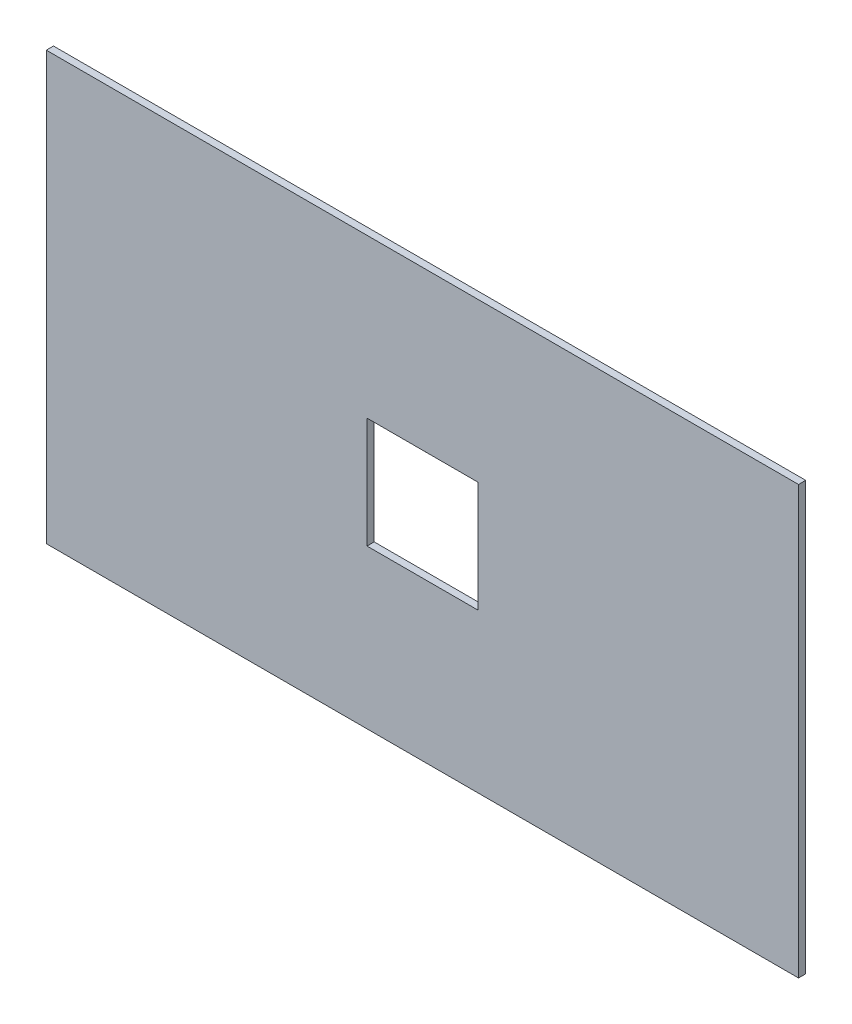
ISO-10303-21;
HEADER;
FILE_DESCRIPTION(('STEP AP214'),'2;1');
FILE_NAME('part.step','',(''),(''),'','','');
FILE_SCHEMA(('AUTOMOTIVE_DESIGN { 1 0 10303 214 1 1 1 1 }'));
ENDSEC;
DATA;
#1=APPLICATION_CONTEXT('core data for automotive mechanical design processes');
#2=APPLICATION_PROTOCOL_DEFINITION('international standard','automotive_design',2000,#1);
#3=PRODUCT_CONTEXT('',#1,'mechanical');
#4=PRODUCT('Part','Part','',(#3));
#5=PRODUCT_RELATED_PRODUCT_CATEGORY('part','',(#4));
#6=PRODUCT_DEFINITION_FORMATION('','',#4);
#7=PRODUCT_DEFINITION_CONTEXT('part definition',#1,'design');
#8=PRODUCT_DEFINITION('design','',#6,#7);
#9=PRODUCT_DEFINITION_SHAPE('','',#8);
#10=(LENGTH_UNIT() NAMED_UNIT(*) SI_UNIT(.MILLI.,.METRE.));
#11=(NAMED_UNIT(*) PLANE_ANGLE_UNIT() SI_UNIT($,.RADIAN.));
#12=(NAMED_UNIT(*) SI_UNIT($,.STERADIAN.) SOLID_ANGLE_UNIT());
#13=UNCERTAINTY_MEASURE_WITH_UNIT(LENGTH_MEASURE(1.E-05),#10,'distance_accuracy_value','');
#14=(GEOMETRIC_REPRESENTATION_CONTEXT(3) GLOBAL_UNCERTAINTY_ASSIGNED_CONTEXT((#13)) GLOBAL_UNIT_ASSIGNED_CONTEXT((#10,
#11,#12)) REPRESENTATION_CONTEXT('',''));
#15=CARTESIAN_POINT('',(0.,0.,0.));
#16=DIRECTION('',(0.,0.,1.));
#17=DIRECTION('',(1.,0.,0.));
#18=AXIS2_PLACEMENT_3D('',#15,#16,#17);
#19=CARTESIAN_POINT('',(0.,0.,2.667));
#20=DIRECTION('',(0.,0.,-1.));
#21=DIRECTION('',(-1.,0.,0.));
#22=AXIS2_PLACEMENT_3D('',#19,#20,#21);
#23=PLANE('',#22);
#24=DIRECTION('',(0.,1.,0.));
#25=VECTOR('',#24,1.);
#26=CARTESIAN_POINT('',(139.7,-79.375,2.667));
#27=LINE('',#26,#25);
#28=CARTESIAN_POINT('',(139.7,-79.375,2.667));
#29=VERTEX_POINT('',#28);
#30=CARTESIAN_POINT('',(139.7,79.375,2.667));
#31=VERTEX_POINT('',#30);
#32=EDGE_CURVE('E144',#29,#31,#27,.T.);
#33=ORIENTED_EDGE('',*,*,#32,.T.);
#34=DIRECTION('',(-1.,0.,0.));
#35=VECTOR('',#34,1.);
#36=CARTESIAN_POINT('',(-139.7,79.375,2.667));
#37=LINE('',#36,#35);
#38=CARTESIAN_POINT('',(-139.7,79.375,2.667));
#39=VERTEX_POINT('',#38);
#40=EDGE_CURVE('E147',#31,#39,#37,.T.);
#41=ORIENTED_EDGE('',*,*,#40,.T.);
#42=DIRECTION('',(0.,-1.,0.));
#43=VECTOR('',#42,1.);
#44=CARTESIAN_POINT('',(-139.7,-79.375,2.667));
#45=LINE('',#44,#43);
#46=CARTESIAN_POINT('',(-139.7,-79.375,2.667));
#47=VERTEX_POINT('',#46);
#48=EDGE_CURVE('E150',#39,#47,#45,.T.);
#49=ORIENTED_EDGE('',*,*,#48,.T.);
#50=DIRECTION('',(1.,0.,0.));
#51=VECTOR('',#50,1.);
#52=CARTESIAN_POINT('',(-139.7,-79.375,2.667));
#53=LINE('',#52,#51);
#54=EDGE_CURVE('E152',#47,#29,#53,.T.);
#55=ORIENTED_EDGE('',*,*,#54,.T.);
#56=EDGE_LOOP('',(#33,#41,#49,#55));
#57=FACE_BOUND('',#56,.T.);
#58=DIRECTION('',(0.,1.,0.));
#59=VECTOR('',#58,1.);
#60=CARTESIAN_POINT('',(20.574,0.,2.667));
#61=LINE('',#60,#59);
#62=CARTESIAN_POINT('',(20.574,-20.574,2.667));
#63=VERTEX_POINT('',#62);
#64=CARTESIAN_POINT('',(20.574,20.574,2.667));
#65=VERTEX_POINT('',#64);
#66=EDGE_CURVE('E111',#63,#65,#61,.T.);
#67=ORIENTED_EDGE('',*,*,#66,.F.);
#68=DIRECTION('',(1.,0.,0.));
#69=VECTOR('',#68,1.);
#70=CARTESIAN_POINT('',(0.,-20.574,2.667));
#71=LINE('',#70,#69);
#72=CARTESIAN_POINT('',(-20.574,-20.574,2.667));
#73=VERTEX_POINT('',#72);
#74=EDGE_CURVE('E114',#73,#63,#71,.T.);
#75=ORIENTED_EDGE('',*,*,#74,.F.);
#76=DIRECTION('',(0.,-1.,0.));
#77=VECTOR('',#76,1.);
#78=CARTESIAN_POINT('',(-20.574,0.,2.667));
#79=LINE('',#78,#77);
#80=CARTESIAN_POINT('',(-20.574,20.574,2.667));
#81=VERTEX_POINT('',#80);
#82=EDGE_CURVE('E138',#81,#73,#79,.T.);
#83=ORIENTED_EDGE('',*,*,#82,.F.);
#84=DIRECTION('',(-1.,0.,0.));
#85=VECTOR('',#84,1.);
#86=CARTESIAN_POINT('',(0.,20.574,2.667));
#87=LINE('',#86,#85);
#88=EDGE_CURVE('E140',#65,#81,#87,.T.);
#89=ORIENTED_EDGE('',*,*,#88,.F.);
#90=EDGE_LOOP('',(#67,#75,#83,#89));
#91=FACE_BOUND('',#90,.T.);
#92=ADVANCED_FACE('F43',(#57,#91),#23,.F.);
#93=CARTESIAN_POINT('',(0.,0.,0.));
#94=DIRECTION('',(0.,0.,-1.));
#95=DIRECTION('',(-1.,0.,0.));
#96=AXIS2_PLACEMENT_3D('',#93,#94,#95);
#97=PLANE('',#96);
#98=DIRECTION('',(0.,1.,0.));
#99=VECTOR('',#98,1.);
#100=CARTESIAN_POINT('',(139.7,-79.375,0.));
#101=LINE('',#100,#99);
#102=CARTESIAN_POINT('',(139.7,-79.375,0.));
#103=VERTEX_POINT('',#102);
#104=CARTESIAN_POINT('',(139.7,79.375,0.));
#105=VERTEX_POINT('',#104);
#106=EDGE_CURVE('E143',#103,#105,#101,.T.);
#107=ORIENTED_EDGE('',*,*,#106,.F.);
#108=DIRECTION('',(1.,0.,0.));
#109=VECTOR('',#108,1.);
#110=CARTESIAN_POINT('',(-139.7,-79.375,0.));
#111=LINE('',#110,#109);
#112=CARTESIAN_POINT('',(-139.7,-79.375,0.));
#113=VERTEX_POINT('',#112);
#114=EDGE_CURVE('E148',#113,#103,#111,.T.);
#115=ORIENTED_EDGE('',*,*,#114,.F.);
#116=DIRECTION('',(0.,-1.,0.));
#117=VECTOR('',#116,1.);
#118=CARTESIAN_POINT('',(-139.7,-79.375,0.));
#119=LINE('',#118,#117);
#120=CARTESIAN_POINT('',(-139.7,79.375,0.));
#121=VERTEX_POINT('',#120);
#122=EDGE_CURVE('E159',#121,#113,#119,.T.);
#123=ORIENTED_EDGE('',*,*,#122,.F.);
#124=DIRECTION('',(-1.,0.,0.));
#125=VECTOR('',#124,1.);
#126=CARTESIAN_POINT('',(-139.7,79.375,0.));
#127=LINE('',#126,#125);
#128=EDGE_CURVE('E157',#105,#121,#127,.T.);
#129=ORIENTED_EDGE('',*,*,#128,.F.);
#130=EDGE_LOOP('',(#107,#115,#123,#129));
#131=FACE_BOUND('',#130,.T.);
#132=DIRECTION('',(1.,0.,0.));
#133=VECTOR('',#132,1.);
#134=CARTESIAN_POINT('',(-20.574,-20.574,0.));
#135=LINE('',#134,#133);
#136=CARTESIAN_POINT('',(-20.574,-20.574,0.));
#137=VERTEX_POINT('',#136);
#138=CARTESIAN_POINT('',(20.574,-20.574,0.));
#139=VERTEX_POINT('',#138);
#140=EDGE_CURVE('E128',#137,#139,#135,.T.);
#141=ORIENTED_EDGE('',*,*,#140,.T.);
#142=DIRECTION('',(0.,1.,0.));
#143=VECTOR('',#142,1.);
#144=CARTESIAN_POINT('',(20.574,-20.574,0.));
#145=LINE('',#144,#143);
#146=CARTESIAN_POINT('',(20.574,20.574,0.));
#147=VERTEX_POINT('',#146);
#148=EDGE_CURVE('E66',#139,#147,#145,.T.);
#149=ORIENTED_EDGE('',*,*,#148,.T.);
#150=DIRECTION('',(-1.,0.,0.));
#151=VECTOR('',#150,1.);
#152=CARTESIAN_POINT('',(-20.574,20.574,0.));
#153=LINE('',#152,#151);
#154=CARTESIAN_POINT('',(-20.574,20.574,0.));
#155=VERTEX_POINT('',#154);
#156=EDGE_CURVE('E118',#147,#155,#153,.T.);
#157=ORIENTED_EDGE('',*,*,#156,.T.);
#158=DIRECTION('',(0.,-1.,0.));
#159=VECTOR('',#158,1.);
#160=CARTESIAN_POINT('',(-20.574,-20.574,0.));
#161=LINE('',#160,#159);
#162=EDGE_CURVE('E124',#155,#137,#161,.T.);
#163=ORIENTED_EDGE('',*,*,#162,.T.);
#164=EDGE_LOOP('',(#141,#149,#157,#163));
#165=FACE_BOUND('',#164,.T.);
#166=ADVANCED_FACE('F127',(#131,#165),#97,.T.);
#167=CARTESIAN_POINT('',(139.7,-79.375,2.667));
#168=DIRECTION('',(-1.,0.,0.));
#169=DIRECTION('',(0.,0.,1.));
#170=AXIS2_PLACEMENT_3D('',#167,#168,#169);
#171=PLANE('',#170);
#172=ORIENTED_EDGE('',*,*,#106,.T.);
#173=DIRECTION('',(0.,0.,-1.));
#174=VECTOR('',#173,1.);
#175=CARTESIAN_POINT('',(139.7,79.375,2.667));
#176=LINE('',#175,#174);
#177=EDGE_CURVE('E11',#31,#105,#176,.T.);
#178=ORIENTED_EDGE('',*,*,#177,.F.);
#179=ORIENTED_EDGE('',*,*,#32,.F.);
#180=DIRECTION('',(0.,0.,-1.));
#181=VECTOR('',#180,1.);
#182=CARTESIAN_POINT('',(139.7,-79.375,2.667));
#183=LINE('',#182,#181);
#184=EDGE_CURVE('E154',#29,#103,#183,.T.);
#185=ORIENTED_EDGE('',*,*,#184,.T.);
#186=EDGE_LOOP('',(#172,#178,#179,#185));
#187=FACE_BOUND('',#186,.T.);
#188=ADVANCED_FACE('F45',(#187),#171,.F.);
#189=CARTESIAN_POINT('',(-139.7,79.375,2.667));
#190=DIRECTION('',(0.,-1.,0.));
#191=DIRECTION('',(0.,0.,-1.));
#192=AXIS2_PLACEMENT_3D('',#189,#190,#191);
#193=PLANE('',#192);
#194=ORIENTED_EDGE('',*,*,#128,.T.);
#195=DIRECTION('',(0.,0.,-1.));
#196=VECTOR('',#195,1.);
#197=CARTESIAN_POINT('',(-139.7,79.375,2.667));
#198=LINE('',#197,#196);
#199=EDGE_CURVE('E51',#39,#121,#198,.T.);
#200=ORIENTED_EDGE('',*,*,#199,.F.);
#201=ORIENTED_EDGE('',*,*,#40,.F.);
#202=ORIENTED_EDGE('',*,*,#177,.T.);
#203=EDGE_LOOP('',(#194,#200,#201,#202));
#204=FACE_BOUND('',#203,.T.);
#205=ADVANCED_FACE('F186',(#204),#193,.F.);
#206=CARTESIAN_POINT('',(-139.7,-79.375,2.667));
#207=DIRECTION('',(1.,0.,0.));
#208=DIRECTION('',(0.,0.,-1.));
#209=AXIS2_PLACEMENT_3D('',#206,#207,#208);
#210=PLANE('',#209);
#211=ORIENTED_EDGE('',*,*,#122,.T.);
#212=DIRECTION('',(0.,0.,-1.));
#213=VECTOR('',#212,1.);
#214=CARTESIAN_POINT('',(-139.7,-79.375,2.667));
#215=LINE('',#214,#213);
#216=EDGE_CURVE('E164',#47,#113,#215,.T.);
#217=ORIENTED_EDGE('',*,*,#216,.F.);
#218=ORIENTED_EDGE('',*,*,#48,.F.);
#219=ORIENTED_EDGE('',*,*,#199,.T.);
#220=EDGE_LOOP('',(#211,#217,#218,#219));
#221=FACE_BOUND('',#220,.T.);
#222=ADVANCED_FACE('F171',(#221),#210,.F.);
#223=CARTESIAN_POINT('',(-139.7,-79.375,2.667));
#224=DIRECTION('',(0.,1.,0.));
#225=DIRECTION('',(0.,0.,1.));
#226=AXIS2_PLACEMENT_3D('',#223,#224,#225);
#227=PLANE('',#226);
#228=ORIENTED_EDGE('',*,*,#114,.T.);
#229=ORIENTED_EDGE('',*,*,#184,.F.);
#230=ORIENTED_EDGE('',*,*,#54,.F.);
#231=ORIENTED_EDGE('',*,*,#216,.T.);
#232=EDGE_LOOP('',(#228,#229,#230,#231));
#233=FACE_BOUND('',#232,.T.);
#234=ADVANCED_FACE('F179',(#233),#227,.F.);
#235=CARTESIAN_POINT('',(20.574,-20.574,47.752));
#236=DIRECTION('',(-1.,0.,0.));
#237=DIRECTION('',(0.,0.,1.));
#238=AXIS2_PLACEMENT_3D('',#235,#236,#237);
#239=PLANE('',#238);
#240=ORIENTED_EDGE('',*,*,#66,.T.);
#241=DIRECTION('',(0.,0.,-1.));
#242=VECTOR('',#241,1.);
#243=CARTESIAN_POINT('',(20.574,20.574,47.752));
#244=LINE('',#243,#242);
#245=EDGE_CURVE('E107',#65,#147,#244,.T.);
#246=ORIENTED_EDGE('',*,*,#245,.T.);
#247=ORIENTED_EDGE('',*,*,#148,.F.);
#248=DIRECTION('',(0.,0.,-1.));
#249=VECTOR('',#248,1.);
#250=CARTESIAN_POINT('',(20.574,-20.574,47.752));
#251=LINE('',#250,#249);
#252=EDGE_CURVE('E133',#63,#139,#251,.T.);
#253=ORIENTED_EDGE('',*,*,#252,.F.);
#254=EDGE_LOOP('',(#240,#246,#247,#253));
#255=FACE_BOUND('',#254,.T.);
#256=ADVANCED_FACE('F109',(#255),#239,.T.);
#257=CARTESIAN_POINT('',(-20.574,20.574,47.752));
#258=DIRECTION('',(0.,-1.,0.));
#259=DIRECTION('',(0.,0.,-1.));
#260=AXIS2_PLACEMENT_3D('',#257,#258,#259);
#261=PLANE('',#260);
#262=ORIENTED_EDGE('',*,*,#88,.T.);
#263=DIRECTION('',(0.,0.,-1.));
#264=VECTOR('',#263,1.);
#265=CARTESIAN_POINT('',(-20.574,20.574,47.752));
#266=LINE('',#265,#264);
#267=EDGE_CURVE('E115',#81,#155,#266,.T.);
#268=ORIENTED_EDGE('',*,*,#267,.T.);
#269=ORIENTED_EDGE('',*,*,#156,.F.);
#270=ORIENTED_EDGE('',*,*,#245,.F.);
#271=EDGE_LOOP('',(#262,#268,#269,#270));
#272=FACE_BOUND('',#271,.T.);
#273=ADVANCED_FACE('F119',(#272),#261,.T.);
#274=CARTESIAN_POINT('',(-20.574,-20.574,47.752));
#275=DIRECTION('',(1.,0.,0.));
#276=DIRECTION('',(0.,0.,-1.));
#277=AXIS2_PLACEMENT_3D('',#274,#275,#276);
#278=PLANE('',#277);
#279=ORIENTED_EDGE('',*,*,#82,.T.);
#280=DIRECTION('',(0.,0.,-1.));
#281=VECTOR('',#280,1.);
#282=CARTESIAN_POINT('',(-20.574,-20.574,47.752));
#283=LINE('',#282,#281);
#284=EDGE_CURVE('E58',#73,#137,#283,.T.);
#285=ORIENTED_EDGE('',*,*,#284,.T.);
#286=ORIENTED_EDGE('',*,*,#162,.F.);
#287=ORIENTED_EDGE('',*,*,#267,.F.);
#288=EDGE_LOOP('',(#279,#285,#286,#287));
#289=FACE_BOUND('',#288,.T.);
#290=ADVANCED_FACE('F209',(#289),#278,.T.);
#291=CARTESIAN_POINT('',(-20.574,-20.574,47.752));
#292=DIRECTION('',(0.,1.,0.));
#293=DIRECTION('',(0.,0.,1.));
#294=AXIS2_PLACEMENT_3D('',#291,#292,#293);
#295=PLANE('',#294);
#296=ORIENTED_EDGE('',*,*,#74,.T.);
#297=ORIENTED_EDGE('',*,*,#252,.T.);
#298=ORIENTED_EDGE('',*,*,#140,.F.);
#299=ORIENTED_EDGE('',*,*,#284,.F.);
#300=EDGE_LOOP('',(#296,#297,#298,#299));
#301=FACE_BOUND('',#300,.T.);
#302=ADVANCED_FACE('F213',(#301),#295,.T.);
#303=CLOSED_SHELL('',(#92,#166,#188,#205,#222,#234,#256,#273,#290,#302));
#304=MANIFOLD_SOLID_BREP('B2',#303);
#305=ADVANCED_BREP_SHAPE_REPRESENTATION('',(#18,#304),#14);
#306=SHAPE_DEFINITION_REPRESENTATION(#9,#305);
ENDSEC;
END-ISO-10303-21;
